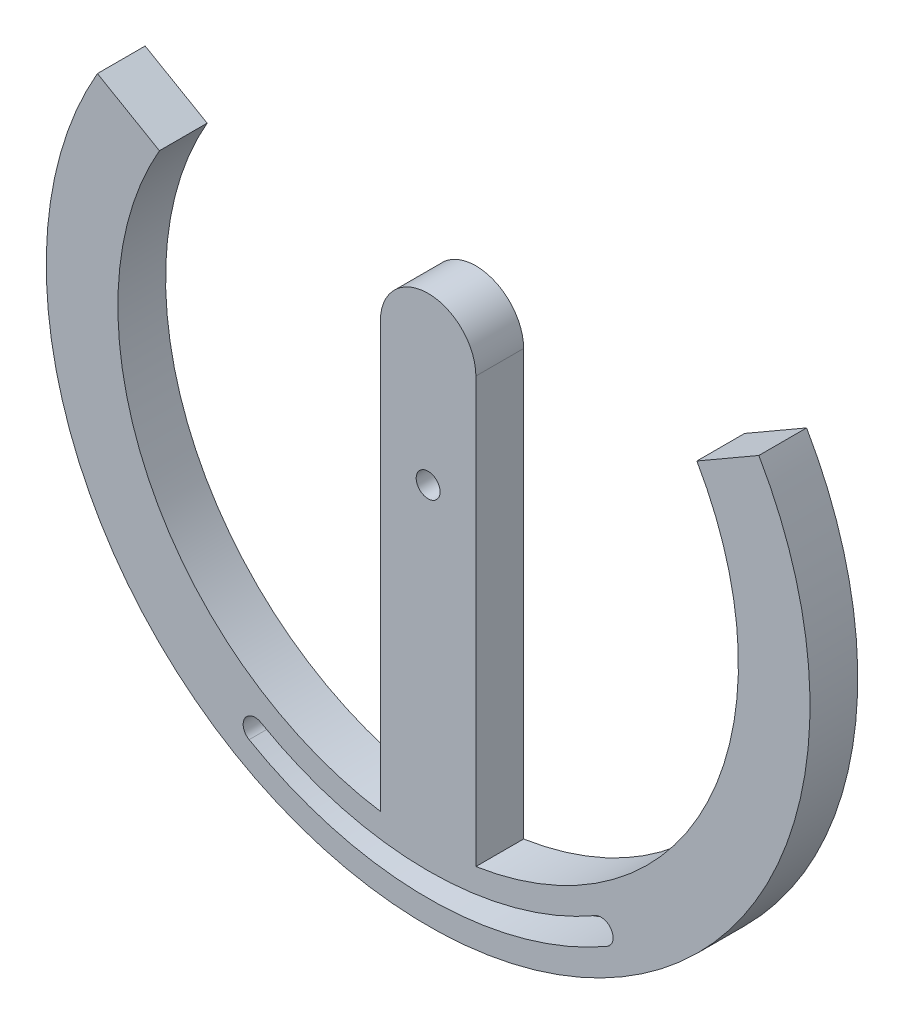
ISO-10303-21;
HEADER;
FILE_DESCRIPTION(('STEP AP214'),'2;1');
FILE_NAME('part.step','',(''),(''),'','','');
FILE_SCHEMA(('AUTOMOTIVE_DESIGN { 1 0 10303 214 1 1 1 1 }'));
ENDSEC;
DATA;
#1=APPLICATION_CONTEXT('core data for automotive mechanical design processes');
#2=APPLICATION_PROTOCOL_DEFINITION('international standard','automotive_design',2000,#1);
#3=PRODUCT_CONTEXT('',#1,'mechanical');
#4=PRODUCT('Part','Part','',(#3));
#5=PRODUCT_RELATED_PRODUCT_CATEGORY('part','',(#4));
#6=PRODUCT_DEFINITION_FORMATION('','',#4);
#7=PRODUCT_DEFINITION_CONTEXT('part definition',#1,'design');
#8=PRODUCT_DEFINITION('design','',#6,#7);
#9=PRODUCT_DEFINITION_SHAPE('','',#8);
#10=(LENGTH_UNIT() NAMED_UNIT(*) SI_UNIT(.MILLI.,.METRE.));
#11=(NAMED_UNIT(*) PLANE_ANGLE_UNIT() SI_UNIT($,.RADIAN.));
#12=(NAMED_UNIT(*) SI_UNIT($,.STERADIAN.) SOLID_ANGLE_UNIT());
#13=UNCERTAINTY_MEASURE_WITH_UNIT(LENGTH_MEASURE(1.E-05),#10,'distance_accuracy_value','');
#14=(GEOMETRIC_REPRESENTATION_CONTEXT(3) GLOBAL_UNCERTAINTY_ASSIGNED_CONTEXT((#13)) GLOBAL_UNIT_ASSIGNED_CONTEXT((#10,
#11,#12)) REPRESENTATION_CONTEXT('',''));
#15=CARTESIAN_POINT('',(0.,0.,0.));
#16=DIRECTION('',(0.,0.,1.));
#17=DIRECTION('',(1.,0.,0.));
#18=AXIS2_PLACEMENT_3D('',#15,#16,#17);
#19=CARTESIAN_POINT('',(0.,0.,12.7));
#20=DIRECTION('',(0.,0.,-1.));
#21=DIRECTION('',(-1.,0.,0.));
#22=AXIS2_PLACEMENT_3D('',#19,#20,#21);
#23=CYLINDRICAL_SURFACE('',#22,101.6);
#24=DIRECTION('',(0.,0.,1.));
#25=VECTOR('',#24,1.);
#26=CARTESIAN_POINT('',(87.9881810244989,50.8000000000001,0.));
#27=LINE('',#26,#25);
#28=CARTESIAN_POINT('',(87.9881810244989,50.8000000000001,0.));
#29=VERTEX_POINT('',#28);
#30=CARTESIAN_POINT('',(87.9881810244989,50.8000000000001,12.7));
#31=VERTEX_POINT('',#30);
#32=EDGE_CURVE('E193',#29,#31,#27,.T.);
#33=ORIENTED_EDGE('',*,*,#32,.T.);
#34=CARTESIAN_POINT('',(0.,0.,12.7));
#35=DIRECTION('',(0.,0.,1.));
#36=DIRECTION('',(1.,0.,0.));
#37=AXIS2_PLACEMENT_3D('',#34,#35,#36);
#38=CIRCLE('',#37,101.6);
#39=CARTESIAN_POINT('',(-87.9881810244993,50.7999999999995,12.7));
#40=VERTEX_POINT('',#39);
#41=EDGE_CURVE('E14',#40,#31,#38,.T.);
#42=ORIENTED_EDGE('',*,*,#41,.F.);
#43=DIRECTION('',(0.,0.,1.));
#44=VECTOR('',#43,1.);
#45=CARTESIAN_POINT('',(-87.9881810244993,50.7999999999995,0.));
#46=LINE('',#45,#44);
#47=CARTESIAN_POINT('',(-87.9881810244993,50.7999999999995,0.));
#48=VERTEX_POINT('',#47);
#49=EDGE_CURVE('E141',#48,#40,#46,.T.);
#50=ORIENTED_EDGE('',*,*,#49,.F.);
#51=CARTESIAN_POINT('',(0.,0.,0.));
#52=DIRECTION('',(0.,0.,1.));
#53=DIRECTION('',(1.,0.,0.));
#54=AXIS2_PLACEMENT_3D('',#51,#52,#53);
#55=CIRCLE('',#54,101.6);
#56=EDGE_CURVE('E46',#48,#29,#55,.T.);
#57=ORIENTED_EDGE('',*,*,#56,.T.);
#58=EDGE_LOOP('',(#33,#42,#50,#57));
#59=FACE_BOUND('',#58,.T.);
#60=ADVANCED_FACE('F43',(#59),#23,.T.);
#61=CARTESIAN_POINT('',(0.,0.,12.7));
#62=DIRECTION('',(0.,0.,1.));
#63=DIRECTION('',(1.,0.,0.));
#64=AXIS2_PLACEMENT_3D('',#61,#62,#63);
#65=PLANE('',#64);
#66=CARTESIAN_POINT('',(0.,0.,12.7));
#67=DIRECTION('',(0.,0.,1.));
#68=DIRECTION('',(1.,0.,0.));
#69=AXIS2_PLACEMENT_3D('',#66,#67,#68);
#70=CIRCLE('',#69,3.175);
#71=CARTESIAN_POINT('',(3.175,0.,12.7));
#72=VERTEX_POINT('',#71);
#73=EDGE_CURVE('E224',#72,#72,#70,.T.);
#74=ORIENTED_EDGE('',*,*,#73,.F.);
#75=EDGE_LOOP('',(#74));
#76=FACE_BOUND('',#75,.T.);
#77=CARTESIAN_POINT('',(46.0375000000137,-79.7392890534443,12.7));
#78=DIRECTION('',(0.,0.,1.));
#79=DIRECTION('',(-1.,0.,0.));
#80=AXIS2_PLACEMENT_3D('',#77,#78,#79);
#81=CIRCLE('',#80,3.17499999999999);
#82=CARTESIAN_POINT('',(47.6250000000142,-82.4889197104596,12.7));
#83=VERTEX_POINT('',#82);
#84=CARTESIAN_POINT('',(44.4500000000132,-76.989658396429,12.7));
#85=VERTEX_POINT('',#84);
#86=EDGE_CURVE('E65',#83,#85,#81,.T.);
#87=ORIENTED_EDGE('',*,*,#86,.F.);
#88=CARTESIAN_POINT('',(0.,0.,12.7));
#89=DIRECTION('',(0.,0.,1.));
#90=DIRECTION('',(-1.,0.,0.));
#91=AXIS2_PLACEMENT_3D('',#88,#89,#90);
#92=CIRCLE('',#91,95.25);
#93=CARTESIAN_POINT('',(-47.6249999999999,-82.4889197104679,12.7));
#94=VERTEX_POINT('',#93);
#95=EDGE_CURVE('E203',#94,#83,#92,.T.);
#96=ORIENTED_EDGE('',*,*,#95,.F.);
#97=CARTESIAN_POINT('',(-46.0374999999999,-79.7392890534523,12.7));
#98=DIRECTION('',(0.,0.,1.));
#99=DIRECTION('',(-1.,0.,0.));
#100=AXIS2_PLACEMENT_3D('',#97,#98,#99);
#101=CIRCLE('',#100,3.175);
#102=CARTESIAN_POINT('',(-44.4499999999999,-76.9896583964367,12.7));
#103=VERTEX_POINT('',#102);
#104=EDGE_CURVE('E217',#103,#94,#101,.T.);
#105=ORIENTED_EDGE('',*,*,#104,.F.);
#106=CARTESIAN_POINT('',(0.,0.,12.7));
#107=DIRECTION('',(0.,0.,-1.));
#108=DIRECTION('',(-1.,0.,0.));
#109=AXIS2_PLACEMENT_3D('',#106,#107,#108);
#110=CIRCLE('',#109,88.9);
#111=EDGE_CURVE('E214',#85,#103,#110,.T.);
#112=ORIENTED_EDGE('',*,*,#111,.F.);
#113=EDGE_LOOP('',(#87,#96,#105,#112));
#114=FACE_BOUND('',#113,.T.);
#115=ORIENTED_EDGE('',*,*,#41,.T.);
#116=DIRECTION('',(-0.866025403784435,-0.500000000000006,0.));
#117=VECTOR('',#116,1.);
#118=CARTESIAN_POINT('',(71.4903970824054,41.275,12.7));
#119=LINE('',#118,#117);
#120=CARTESIAN_POINT('',(71.4903970824054,41.275,12.7));
#121=VERTEX_POINT('',#120);
#122=EDGE_CURVE('E178',#31,#121,#119,.T.);
#123=ORIENTED_EDGE('',*,*,#122,.T.);
#124=CARTESIAN_POINT('',(0.,0.,12.7));
#125=DIRECTION('',(0.,0.,-1.));
#126=DIRECTION('',(-1.,0.,0.));
#127=AXIS2_PLACEMENT_3D('',#124,#125,#126);
#128=CIRCLE('',#127,82.55);
#129=CARTESIAN_POINT('',(12.7,-81.5672268745236,12.7));
#130=VERTEX_POINT('',#129);
#131=EDGE_CURVE('E181',#121,#130,#128,.T.);
#132=ORIENTED_EDGE('',*,*,#131,.T.);
#133=DIRECTION('',(0.,1.,0.));
#134=VECTOR('',#133,1.);
#135=CARTESIAN_POINT('',(12.7,31.4503564540587,12.7));
#136=LINE('',#135,#134);
#137=CARTESIAN_POINT('',(12.7,31.4503564540587,12.7));
#138=VERTEX_POINT('',#137);
#139=EDGE_CURVE('E184',#130,#138,#136,.T.);
#140=ORIENTED_EDGE('',*,*,#139,.T.);
#141=CARTESIAN_POINT('',(0.,31.4503564540587,12.7));
#142=DIRECTION('',(0.,0.,1.));
#143=DIRECTION('',(1.,0.,0.));
#144=AXIS2_PLACEMENT_3D('',#141,#142,#143);
#145=CIRCLE('',#144,12.7);
#146=CARTESIAN_POINT('',(-12.7,31.4503564540587,12.7));
#147=VERTEX_POINT('',#146);
#148=EDGE_CURVE('E169',#138,#147,#145,.T.);
#149=ORIENTED_EDGE('',*,*,#148,.T.);
#150=DIRECTION('',(0.,-1.,0.));
#151=VECTOR('',#150,1.);
#152=CARTESIAN_POINT('',(-12.7,31.4503564540587,12.7));
#153=LINE('',#152,#151);
#154=CARTESIAN_POINT('',(-12.7,-81.5672268745236,12.7));
#155=VERTEX_POINT('',#154);
#156=EDGE_CURVE('E172',#147,#155,#153,.T.);
#157=ORIENTED_EDGE('',*,*,#156,.T.);
#158=CARTESIAN_POINT('',(0.,0.,12.7));
#159=DIRECTION('',(0.,0.,-1.));
#160=DIRECTION('',(1.,0.,0.));
#161=AXIS2_PLACEMENT_3D('',#158,#159,#160);
#162=CIRCLE('',#161,82.55);
#163=CARTESIAN_POINT('',(-71.4903970824054,41.275,12.7));
#164=VERTEX_POINT('',#163);
#165=EDGE_CURVE('E175',#155,#164,#162,.T.);
#166=ORIENTED_EDGE('',*,*,#165,.T.);
#167=DIRECTION('',(-0.866025403784455,0.499999999999971,0.));
#168=VECTOR('',#167,1.);
#169=CARTESIAN_POINT('',(-87.9881810244993,50.7999999999995,12.7));
#170=LINE('',#169,#168);
#171=EDGE_CURVE('E137',#164,#40,#170,.T.);
#172=ORIENTED_EDGE('',*,*,#171,.T.);
#173=EDGE_LOOP('',(#115,#123,#132,#140,#149,#157,#166,#172));
#174=FACE_BOUND('',#173,.T.);
#175=ADVANCED_FACE('F238',(#76,#114,#174),#65,.T.);
#176=CARTESIAN_POINT('',(0.,0.,0.));
#177=DIRECTION('',(0.,0.,1.));
#178=DIRECTION('',(1.,0.,0.));
#179=AXIS2_PLACEMENT_3D('',#176,#177,#178);
#180=PLANE('',#179);
#181=CARTESIAN_POINT('',(0.,0.,0.));
#182=DIRECTION('',(0.,0.,1.));
#183=DIRECTION('',(1.,0.,0.));
#184=AXIS2_PLACEMENT_3D('',#181,#182,#183);
#185=CIRCLE('',#184,3.175);
#186=CARTESIAN_POINT('',(3.175,0.,0.));
#187=VERTEX_POINT('',#186);
#188=EDGE_CURVE('E230',#187,#187,#185,.T.);
#189=ORIENTED_EDGE('',*,*,#188,.T.);
#190=EDGE_LOOP('',(#189));
#191=FACE_BOUND('',#190,.T.);
#192=CARTESIAN_POINT('',(0.,0.,0.));
#193=DIRECTION('',(0.,0.,1.));
#194=DIRECTION('',(-1.,0.,0.));
#195=AXIS2_PLACEMENT_3D('',#192,#193,#194);
#196=CIRCLE('',#195,95.25);
#197=CARTESIAN_POINT('',(-47.6249999999999,-82.4889197104679,0.));
#198=VERTEX_POINT('',#197);
#199=CARTESIAN_POINT('',(47.6250000000142,-82.4889197104596,0.));
#200=VERTEX_POINT('',#199);
#201=EDGE_CURVE('E209',#198,#200,#196,.T.);
#202=ORIENTED_EDGE('',*,*,#201,.T.);
#203=CARTESIAN_POINT('',(46.0375000000137,-79.7392890534443,0.));
#204=DIRECTION('',(0.,0.,1.));
#205=DIRECTION('',(-1.,0.,0.));
#206=AXIS2_PLACEMENT_3D('',#203,#204,#205);
#207=CIRCLE('',#206,3.17499999999999);
#208=CARTESIAN_POINT('',(44.4500000000132,-76.989658396429,0.));
#209=VERTEX_POINT('',#208);
#210=EDGE_CURVE('E199',#200,#209,#207,.T.);
#211=ORIENTED_EDGE('',*,*,#210,.T.);
#212=CARTESIAN_POINT('',(0.,0.,0.));
#213=DIRECTION('',(0.,0.,-1.));
#214=DIRECTION('',(-1.,0.,0.));
#215=AXIS2_PLACEMENT_3D('',#212,#213,#214);
#216=CIRCLE('',#215,88.9);
#217=CARTESIAN_POINT('',(-44.4499999999999,-76.9896583964367,0.));
#218=VERTEX_POINT('',#217);
#219=EDGE_CURVE('E202',#209,#218,#216,.T.);
#220=ORIENTED_EDGE('',*,*,#219,.T.);
#221=CARTESIAN_POINT('',(-46.0374999999999,-79.7392890534523,0.));
#222=DIRECTION('',(0.,0.,1.));
#223=DIRECTION('',(-1.,0.,0.));
#224=AXIS2_PLACEMENT_3D('',#221,#222,#223);
#225=CIRCLE('',#224,3.175);
#226=EDGE_CURVE('E206',#218,#198,#225,.T.);
#227=ORIENTED_EDGE('',*,*,#226,.T.);
#228=EDGE_LOOP('',(#202,#211,#220,#227));
#229=FACE_BOUND('',#228,.T.);
#230=DIRECTION('',(-0.866025403784435,-0.500000000000006,0.));
#231=VECTOR('',#230,1.);
#232=CARTESIAN_POINT('',(71.4903970824054,41.275,0.));
#233=LINE('',#232,#231);
#234=CARTESIAN_POINT('',(71.4903970824054,41.275,0.));
#235=VERTEX_POINT('',#234);
#236=EDGE_CURVE('E156',#29,#235,#233,.T.);
#237=ORIENTED_EDGE('',*,*,#236,.F.);
#238=ORIENTED_EDGE('',*,*,#56,.F.);
#239=DIRECTION('',(-0.866025403784455,0.499999999999971,0.));
#240=VECTOR('',#239,1.);
#241=CARTESIAN_POINT('',(-87.9881810244993,50.7999999999995,0.));
#242=LINE('',#241,#240);
#243=CARTESIAN_POINT('',(-71.4903970824054,41.275,0.));
#244=VERTEX_POINT('',#243);
#245=EDGE_CURVE('E134',#244,#48,#242,.T.);
#246=ORIENTED_EDGE('',*,*,#245,.F.);
#247=CARTESIAN_POINT('',(0.,0.,0.));
#248=DIRECTION('',(0.,0.,-1.));
#249=DIRECTION('',(1.,0.,0.));
#250=AXIS2_PLACEMENT_3D('',#247,#248,#249);
#251=CIRCLE('',#250,82.55);
#252=CARTESIAN_POINT('',(-12.7,-81.5672268745236,0.));
#253=VERTEX_POINT('',#252);
#254=EDGE_CURVE('E145',#253,#244,#251,.T.);
#255=ORIENTED_EDGE('',*,*,#254,.F.);
#256=DIRECTION('',(0.,-1.,0.));
#257=VECTOR('',#256,1.);
#258=CARTESIAN_POINT('',(-12.7,31.4503564540587,0.));
#259=LINE('',#258,#257);
#260=CARTESIAN_POINT('',(-12.7,31.4503564540587,0.));
#261=VERTEX_POINT('',#260);
#262=EDGE_CURVE('E150',#261,#253,#259,.T.);
#263=ORIENTED_EDGE('',*,*,#262,.F.);
#264=CARTESIAN_POINT('',(0.,31.4503564540587,0.));
#265=DIRECTION('',(0.,0.,1.));
#266=DIRECTION('',(1.,0.,0.));
#267=AXIS2_PLACEMENT_3D('',#264,#265,#266);
#268=CIRCLE('',#267,12.7);
#269=CARTESIAN_POINT('',(12.7,31.4503564540587,0.));
#270=VERTEX_POINT('',#269);
#271=EDGE_CURVE('E57',#270,#261,#268,.T.);
#272=ORIENTED_EDGE('',*,*,#271,.F.);
#273=DIRECTION('',(0.,1.,0.));
#274=VECTOR('',#273,1.);
#275=CARTESIAN_POINT('',(12.7,31.4503564540587,0.));
#276=LINE('',#275,#274);
#277=CARTESIAN_POINT('',(12.7,-81.5672268745236,0.));
#278=VERTEX_POINT('',#277);
#279=EDGE_CURVE('E165',#278,#270,#276,.T.);
#280=ORIENTED_EDGE('',*,*,#279,.F.);
#281=CARTESIAN_POINT('',(0.,0.,0.));
#282=DIRECTION('',(0.,0.,-1.));
#283=DIRECTION('',(-1.,0.,0.));
#284=AXIS2_PLACEMENT_3D('',#281,#282,#283);
#285=CIRCLE('',#284,82.55);
#286=EDGE_CURVE('E159',#235,#278,#285,.T.);
#287=ORIENTED_EDGE('',*,*,#286,.F.);
#288=EDGE_LOOP('',(#237,#238,#246,#255,#263,#272,#280,#287));
#289=FACE_BOUND('',#288,.T.);
#290=ADVANCED_FACE('F154',(#191,#229,#289),#180,.F.);
#291=CARTESIAN_POINT('',(0.,0.,0.));
#292=DIRECTION('',(0.,0.,1.));
#293=DIRECTION('',(1.,0.,0.));
#294=AXIS2_PLACEMENT_3D('',#291,#292,#293);
#295=CYLINDRICAL_SURFACE('',#294,3.175);
#296=ORIENTED_EDGE('',*,*,#188,.F.);
#297=EDGE_LOOP('',(#296));
#298=FACE_BOUND('',#297,.T.);
#299=ORIENTED_EDGE('',*,*,#73,.T.);
#300=EDGE_LOOP('',(#299));
#301=FACE_BOUND('',#300,.T.);
#302=ADVANCED_FACE('F236',(#298,#301),#295,.F.);
#303=CARTESIAN_POINT('',(46.0375000000137,-79.7392890534443,0.));
#304=DIRECTION('',(0.,0.,1.));
#305=DIRECTION('',(1.,0.,0.));
#306=AXIS2_PLACEMENT_3D('',#303,#304,#305);
#307=CYLINDRICAL_SURFACE('',#306,3.17499999999999);
#308=ORIENTED_EDGE('',*,*,#86,.T.);
#309=DIRECTION('',(0.,0.,1.));
#310=VECTOR('',#309,1.);
#311=CARTESIAN_POINT('',(44.4500000000132,-76.989658396429,0.));
#312=LINE('',#311,#310);
#313=EDGE_CURVE('E212',#209,#85,#312,.T.);
#314=ORIENTED_EDGE('',*,*,#313,.F.);
#315=ORIENTED_EDGE('',*,*,#210,.F.);
#316=DIRECTION('',(0.,0.,1.));
#317=VECTOR('',#316,1.);
#318=CARTESIAN_POINT('',(47.6250000000142,-82.4889197104596,0.));
#319=LINE('',#318,#317);
#320=EDGE_CURVE('E222',#200,#83,#319,.T.);
#321=ORIENTED_EDGE('',*,*,#320,.T.);
#322=EDGE_LOOP('',(#308,#314,#315,#321));
#323=FACE_BOUND('',#322,.T.);
#324=ADVANCED_FACE('F291',(#323),#307,.F.);
#325=CARTESIAN_POINT('',(0.,0.,0.));
#326=DIRECTION('',(0.,0.,1.));
#327=DIRECTION('',(1.,0.,0.));
#328=AXIS2_PLACEMENT_3D('',#325,#326,#327);
#329=CYLINDRICAL_SURFACE('',#328,95.25);
#330=ORIENTED_EDGE('',*,*,#95,.T.);
#331=ORIENTED_EDGE('',*,*,#320,.F.);
#332=ORIENTED_EDGE('',*,*,#201,.F.);
#333=DIRECTION('',(0.,0.,1.));
#334=VECTOR('',#333,1.);
#335=CARTESIAN_POINT('',(-47.6249999999999,-82.4889197104679,0.));
#336=LINE('',#335,#334);
#337=EDGE_CURVE('E225',#198,#94,#336,.T.);
#338=ORIENTED_EDGE('',*,*,#337,.T.);
#339=EDGE_LOOP('',(#330,#331,#332,#338));
#340=FACE_BOUND('',#339,.T.);
#341=ADVANCED_FACE('F299',(#340),#329,.F.);
#342=CARTESIAN_POINT('',(-46.0374999999999,-79.7392890534523,0.));
#343=DIRECTION('',(0.,0.,1.));
#344=DIRECTION('',(1.,0.,0.));
#345=AXIS2_PLACEMENT_3D('',#342,#343,#344);
#346=CYLINDRICAL_SURFACE('',#345,3.175);
#347=ORIENTED_EDGE('',*,*,#104,.T.);
#348=ORIENTED_EDGE('',*,*,#337,.F.);
#349=ORIENTED_EDGE('',*,*,#226,.F.);
#350=DIRECTION('',(0.,0.,1.));
#351=VECTOR('',#350,1.);
#352=CARTESIAN_POINT('',(-44.4499999999999,-76.9896583964367,0.));
#353=LINE('',#352,#351);
#354=EDGE_CURVE('E227',#218,#103,#353,.T.);
#355=ORIENTED_EDGE('',*,*,#354,.T.);
#356=EDGE_LOOP('',(#347,#348,#349,#355));
#357=FACE_BOUND('',#356,.T.);
#358=ADVANCED_FACE('F306',(#357),#346,.F.);
#359=CARTESIAN_POINT('',(0.,0.,0.));
#360=DIRECTION('',(0.,0.,1.));
#361=DIRECTION('',(1.,0.,0.));
#362=AXIS2_PLACEMENT_3D('',#359,#360,#361);
#363=CYLINDRICAL_SURFACE('',#362,88.9);
#364=ORIENTED_EDGE('',*,*,#111,.T.);
#365=ORIENTED_EDGE('',*,*,#354,.F.);
#366=ORIENTED_EDGE('',*,*,#219,.F.);
#367=ORIENTED_EDGE('',*,*,#313,.T.);
#368=EDGE_LOOP('',(#364,#365,#366,#367));
#369=FACE_BOUND('',#368,.T.);
#370=ADVANCED_FACE('F314',(#369),#363,.T.);
#371=CARTESIAN_POINT('',(0.,31.4503564540587,0.));
#372=DIRECTION('',(0.,0.,1.));
#373=DIRECTION('',(1.,0.,0.));
#374=AXIS2_PLACEMENT_3D('',#371,#372,#373);
#375=CYLINDRICAL_SURFACE('',#374,12.7);
#376=ORIENTED_EDGE('',*,*,#148,.F.);
#377=DIRECTION('',(0.,0.,1.));
#378=VECTOR('',#377,1.);
#379=CARTESIAN_POINT('',(12.7,31.4503564540587,0.));
#380=LINE('',#379,#378);
#381=EDGE_CURVE('E187',#270,#138,#380,.T.);
#382=ORIENTED_EDGE('',*,*,#381,.F.);
#383=ORIENTED_EDGE('',*,*,#271,.T.);
#384=DIRECTION('',(0.,0.,1.));
#385=VECTOR('',#384,1.);
#386=CARTESIAN_POINT('',(-12.7,31.4503564540587,0.));
#387=LINE('',#386,#385);
#388=EDGE_CURVE('E168',#261,#147,#387,.T.);
#389=ORIENTED_EDGE('',*,*,#388,.T.);
#390=EDGE_LOOP('',(#376,#382,#383,#389));
#391=FACE_BOUND('',#390,.T.);
#392=ADVANCED_FACE('F258',(#391),#375,.T.);
#393=CARTESIAN_POINT('',(12.7,31.4503564540587,0.));
#394=DIRECTION('',(1.,0.,0.));
#395=DIRECTION('',(0.,0.,-1.));
#396=AXIS2_PLACEMENT_3D('',#393,#394,#395);
#397=PLANE('',#396);
#398=ORIENTED_EDGE('',*,*,#139,.F.);
#399=DIRECTION('',(0.,0.,1.));
#400=VECTOR('',#399,1.);
#401=CARTESIAN_POINT('',(12.7,-81.5672268745236,0.));
#402=LINE('',#401,#400);
#403=EDGE_CURVE('E189',#278,#130,#402,.T.);
#404=ORIENTED_EDGE('',*,*,#403,.F.);
#405=ORIENTED_EDGE('',*,*,#279,.T.);
#406=ORIENTED_EDGE('',*,*,#381,.T.);
#407=EDGE_LOOP('',(#398,#404,#405,#406));
#408=FACE_BOUND('',#407,.T.);
#409=ADVANCED_FACE('F257',(#408),#397,.T.);
#410=CARTESIAN_POINT('',(0.,0.,0.));
#411=DIRECTION('',(0.,0.,1.));
#412=DIRECTION('',(1.,0.,0.));
#413=AXIS2_PLACEMENT_3D('',#410,#411,#412);
#414=CYLINDRICAL_SURFACE('',#413,82.55);
#415=ORIENTED_EDGE('',*,*,#131,.F.);
#416=DIRECTION('',(0.,0.,1.));
#417=VECTOR('',#416,1.);
#418=CARTESIAN_POINT('',(71.4903970824054,41.275,0.));
#419=LINE('',#418,#417);
#420=EDGE_CURVE('E191',#235,#121,#419,.T.);
#421=ORIENTED_EDGE('',*,*,#420,.F.);
#422=ORIENTED_EDGE('',*,*,#286,.T.);
#423=ORIENTED_EDGE('',*,*,#403,.T.);
#424=EDGE_LOOP('',(#415,#421,#422,#423));
#425=FACE_BOUND('',#424,.T.);
#426=ADVANCED_FACE('F253',(#425),#414,.F.);
#427=CARTESIAN_POINT('',(71.4903970824054,41.275,0.));
#428=DIRECTION('',(-0.500000000000006,0.866025403784435,0.));
#429=DIRECTION('',(-0.866025403784435,-0.500000000000006,0.));
#430=AXIS2_PLACEMENT_3D('',#427,#428,#429);
#431=PLANE('',#430);
#432=ORIENTED_EDGE('',*,*,#122,.F.);
#433=ORIENTED_EDGE('',*,*,#32,.F.);
#434=ORIENTED_EDGE('',*,*,#236,.T.);
#435=ORIENTED_EDGE('',*,*,#420,.T.);
#436=EDGE_LOOP('',(#432,#433,#434,#435));
#437=FACE_BOUND('',#436,.T.);
#438=ADVANCED_FACE('F248',(#437),#431,.T.);
#439=CARTESIAN_POINT('',(-87.9881810244993,50.7999999999995,0.));
#440=DIRECTION('',(0.499999999999971,0.866025403784455,0.));
#441=DIRECTION('',(-0.866025403784455,0.499999999999971,0.));
#442=AXIS2_PLACEMENT_3D('',#439,#440,#441);
#443=PLANE('',#442);
#444=ORIENTED_EDGE('',*,*,#171,.F.);
#445=DIRECTION('',(0.,0.,1.));
#446=VECTOR('',#445,1.);
#447=CARTESIAN_POINT('',(-71.4903970824054,41.275,0.));
#448=LINE('',#447,#446);
#449=EDGE_CURVE('E130',#244,#164,#448,.T.);
#450=ORIENTED_EDGE('',*,*,#449,.F.);
#451=ORIENTED_EDGE('',*,*,#245,.T.);
#452=ORIENTED_EDGE('',*,*,#49,.T.);
#453=EDGE_LOOP('',(#444,#450,#451,#452));
#454=FACE_BOUND('',#453,.T.);
#455=ADVANCED_FACE('F132',(#454),#443,.T.);
#456=CARTESIAN_POINT('',(0.,0.,0.));
#457=DIRECTION('',(0.,0.,1.));
#458=DIRECTION('',(1.,0.,0.));
#459=AXIS2_PLACEMENT_3D('',#456,#457,#458);
#460=CYLINDRICAL_SURFACE('',#459,82.55);
#461=ORIENTED_EDGE('',*,*,#165,.F.);
#462=DIRECTION('',(0.,0.,1.));
#463=VECTOR('',#462,1.);
#464=CARTESIAN_POINT('',(-12.7,-81.5672268745236,0.));
#465=LINE('',#464,#463);
#466=EDGE_CURVE('E142',#253,#155,#465,.T.);
#467=ORIENTED_EDGE('',*,*,#466,.F.);
#468=ORIENTED_EDGE('',*,*,#254,.T.);
#469=ORIENTED_EDGE('',*,*,#449,.T.);
#470=EDGE_LOOP('',(#461,#467,#468,#469));
#471=FACE_BOUND('',#470,.T.);
#472=ADVANCED_FACE('F146',(#471),#460,.F.);
#473=CARTESIAN_POINT('',(-12.7,31.4503564540587,0.));
#474=DIRECTION('',(-1.,0.,0.));
#475=DIRECTION('',(0.,0.,1.));
#476=AXIS2_PLACEMENT_3D('',#473,#474,#475);
#477=PLANE('',#476);
#478=ORIENTED_EDGE('',*,*,#156,.F.);
#479=ORIENTED_EDGE('',*,*,#388,.F.);
#480=ORIENTED_EDGE('',*,*,#262,.T.);
#481=ORIENTED_EDGE('',*,*,#466,.T.);
#482=EDGE_LOOP('',(#478,#479,#480,#481));
#483=FACE_BOUND('',#482,.T.);
#484=ADVANCED_FACE('F261',(#483),#477,.T.);
#485=CLOSED_SHELL('',(#60,#175,#290,#302,#324,#341,#358,#370,#392,#409,#426,#438,#455,#472,#484));
#486=MANIFOLD_SOLID_BREP('B2',#485);
#487=ADVANCED_BREP_SHAPE_REPRESENTATION('',(#18,#486),#14);
#488=SHAPE_DEFINITION_REPRESENTATION(#9,#487);
ENDSEC;
END-ISO-10303-21;
